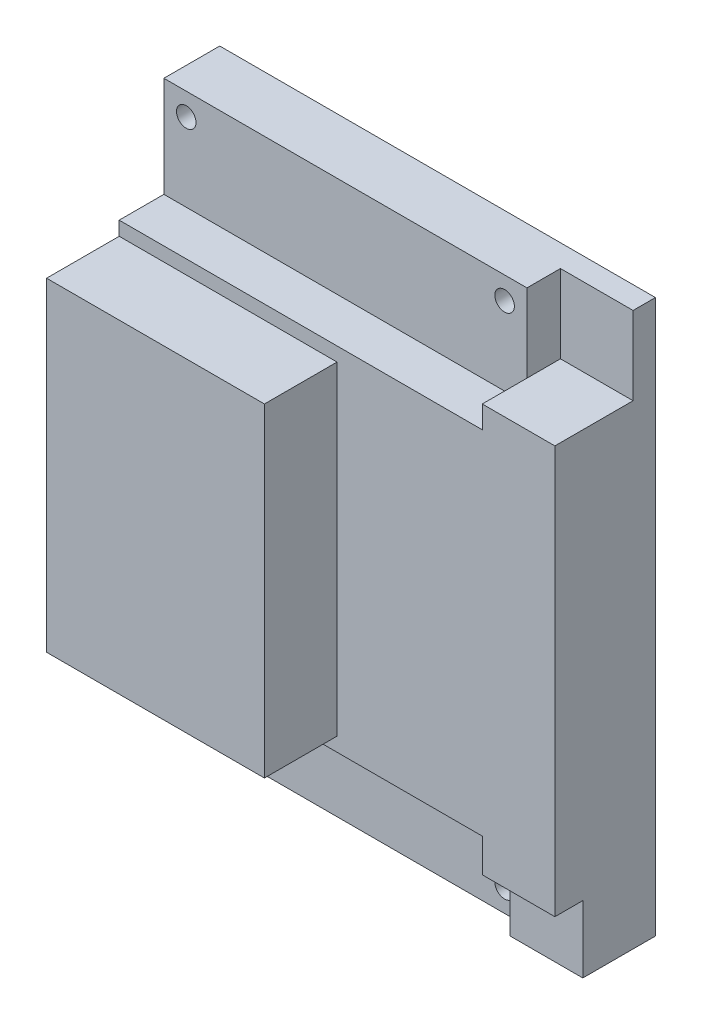
ISO-10303-21;
HEADER;
FILE_DESCRIPTION(('STEP AP214'),'2;1');
FILE_NAME('part.step','',(''),(''),'','','');
FILE_SCHEMA(('AUTOMOTIVE_DESIGN { 1 0 10303 214 1 1 1 1 }'));
ENDSEC;
DATA;
#1=APPLICATION_CONTEXT('core data for automotive mechanical design processes');
#2=APPLICATION_PROTOCOL_DEFINITION('international standard','automotive_design',2000,#1);
#3=PRODUCT_CONTEXT('',#1,'mechanical');
#4=PRODUCT('Part','Part','',(#3));
#5=PRODUCT_RELATED_PRODUCT_CATEGORY('part','',(#4));
#6=PRODUCT_DEFINITION_FORMATION('','',#4);
#7=PRODUCT_DEFINITION_CONTEXT('part definition',#1,'design');
#8=PRODUCT_DEFINITION('design','',#6,#7);
#9=PRODUCT_DEFINITION_SHAPE('','',#8);
#10=(LENGTH_UNIT() NAMED_UNIT(*) SI_UNIT(.MILLI.,.METRE.));
#11=(NAMED_UNIT(*) PLANE_ANGLE_UNIT() SI_UNIT($,.RADIAN.));
#12=(NAMED_UNIT(*) SI_UNIT($,.STERADIAN.) SOLID_ANGLE_UNIT());
#13=UNCERTAINTY_MEASURE_WITH_UNIT(LENGTH_MEASURE(1.E-05),#10,'distance_accuracy_value','');
#14=(GEOMETRIC_REPRESENTATION_CONTEXT(3) GLOBAL_UNCERTAINTY_ASSIGNED_CONTEXT((#13)) GLOBAL_UNIT_ASSIGNED_CONTEXT((#10,
#11,#12)) REPRESENTATION_CONTEXT('',''));
#15=CARTESIAN_POINT('',(0.,0.,0.));
#16=DIRECTION('',(0.,0.,1.));
#17=DIRECTION('',(1.,0.,0.));
#18=AXIS2_PLACEMENT_3D('',#15,#16,#17);
#19=CARTESIAN_POINT('',(32.5,42.5,4.));
#20=DIRECTION('',(0.,0.,1.));
#21=DIRECTION('',(1.,0.,0.));
#22=AXIS2_PLACEMENT_3D('',#19,#20,#21);
#23=PLANE('',#22);
#24=DIRECTION('',(0.,-1.,0.));
#25=VECTOR('',#24,1.);
#26=CARTESIAN_POINT('',(26.,49.5,4.));
#27=LINE('',#26,#25);
#28=CARTESIAN_POINT('',(26.,49.5,4.));
#29=VERTEX_POINT('',#28);
#30=CARTESIAN_POINT('',(26.,35.5,4.));
#31=VERTEX_POINT('',#30);
#32=EDGE_CURVE('E10',#29,#31,#27,.T.);
#33=ORIENTED_EDGE('',*,*,#32,.T.);
#34=DIRECTION('',(1.,0.,0.));
#35=VECTOR('',#34,1.);
#36=CARTESIAN_POINT('',(26.,35.5,4.));
#37=LINE('',#36,#35);
#38=CARTESIAN_POINT('',(39.,35.5,4.));
#39=VERTEX_POINT('',#38);
#40=EDGE_CURVE('E387',#31,#39,#37,.T.);
#41=ORIENTED_EDGE('',*,*,#40,.T.);
#42=DIRECTION('',(0.,1.,0.));
#43=VECTOR('',#42,1.);
#44=CARTESIAN_POINT('',(39.,35.5,4.));
#45=LINE('',#44,#43);
#46=CARTESIAN_POINT('',(39.,49.5,4.));
#47=VERTEX_POINT('',#46);
#48=EDGE_CURVE('E364',#39,#47,#45,.T.);
#49=ORIENTED_EDGE('',*,*,#48,.T.);
#50=DIRECTION('',(-1.,0.,0.));
#51=VECTOR('',#50,1.);
#52=CARTESIAN_POINT('',(39.,49.5,4.));
#53=LINE('',#52,#51);
#54=EDGE_CURVE('E422',#47,#29,#53,.T.);
#55=ORIENTED_EDGE('',*,*,#54,.T.);
#56=EDGE_LOOP('',(#33,#41,#49,#55));
#57=FACE_BOUND('',#56,.T.);
#58=ADVANCED_FACE('F15',(#57),#23,.T.);
#59=CARTESIAN_POINT('',(26.,49.5,18.));
#60=DIRECTION('',(-1.,0.,0.));
#61=DIRECTION('',(0.,0.,1.));
#62=AXIS2_PLACEMENT_3D('',#59,#60,#61);
#63=PLANE('',#62);
#64=DIRECTION('',(0.,0.,-1.));
#65=VECTOR('',#64,1.);
#66=CARTESIAN_POINT('',(26.,35.5,18.));
#67=LINE('',#66,#65);
#68=CARTESIAN_POINT('',(26.,35.5,10.));
#69=VERTEX_POINT('',#68);
#70=EDGE_CURVE('E18',#69,#31,#67,.T.);
#71=ORIENTED_EDGE('',*,*,#70,.T.);
#72=ORIENTED_EDGE('',*,*,#32,.F.);
#73=DIRECTION('',(0.,0.,-1.));
#74=VECTOR('',#73,1.);
#75=CARTESIAN_POINT('',(26.,49.5,18.));
#76=LINE('',#75,#74);
#77=CARTESIAN_POINT('',(26.,49.5,10.));
#78=VERTEX_POINT('',#77);
#79=EDGE_CURVE('E414',#78,#29,#76,.T.);
#80=ORIENTED_EDGE('',*,*,#79,.F.);
#81=DIRECTION('',(0.,1.,0.));
#82=VECTOR('',#81,1.);
#83=CARTESIAN_POINT('',(26.,31.5,10.));
#84=LINE('',#83,#82);
#85=EDGE_CURVE('E227',#69,#78,#84,.T.);
#86=ORIENTED_EDGE('',*,*,#85,.F.);
#87=EDGE_LOOP('',(#71,#72,#80,#86));
#88=FACE_BOUND('',#87,.T.);
#89=ADVANCED_FACE('F451',(#88),#63,.F.);
#90=CARTESIAN_POINT('',(0.,-29.,31.));
#91=DIRECTION('',(1.,0.,0.));
#92=DIRECTION('',(0.,1.,0.));
#93=AXIS2_PLACEMENT_3D('',#90,#91,#92);
#94=PLANE('',#93);
#95=DIRECTION('',(0.,0.,-1.));
#96=VECTOR('',#95,1.);
#97=CARTESIAN_POINT('',(0.,-29.,31.));
#98=LINE('',#97,#96);
#99=CARTESIAN_POINT('',(0.,-29.,31.));
#100=VERTEX_POINT('',#99);
#101=CARTESIAN_POINT('',(0.,-29.,18.));
#102=VERTEX_POINT('',#101);
#103=EDGE_CURVE('E382',#100,#102,#98,.T.);
#104=ORIENTED_EDGE('',*,*,#103,.T.);
#105=DIRECTION('',(0.,1.,0.));
#106=VECTOR('',#105,1.);
#107=CARTESIAN_POINT('',(0.,-29.,18.));
#108=LINE('',#107,#106);
#109=CARTESIAN_POINT('',(0.,29.,18.));
#110=VERTEX_POINT('',#109);
#111=EDGE_CURVE('E265',#102,#110,#108,.T.);
#112=ORIENTED_EDGE('',*,*,#111,.T.);
#113=DIRECTION('',(0.,0.,-1.));
#114=VECTOR('',#113,1.);
#115=CARTESIAN_POINT('',(0.,29.,31.));
#116=LINE('',#115,#114);
#117=CARTESIAN_POINT('',(0.,29.,31.));
#118=VERTEX_POINT('',#117);
#119=EDGE_CURVE('E399',#118,#110,#116,.T.);
#120=ORIENTED_EDGE('',*,*,#119,.F.);
#121=DIRECTION('',(0.,1.,0.));
#122=VECTOR('',#121,1.);
#123=CARTESIAN_POINT('',(0.,-29.,31.));
#124=LINE('',#123,#122);
#125=EDGE_CURVE('E395',#100,#118,#124,.T.);
#126=ORIENTED_EDGE('',*,*,#125,.F.);
#127=EDGE_LOOP('',(#104,#112,#120,#126));
#128=FACE_BOUND('',#127,.T.);
#129=ADVANCED_FACE('F551',(#128),#94,.T.);
#130=CARTESIAN_POINT('',(39.,-37.5,18.));
#131=DIRECTION('',(0.,1.,0.));
#132=DIRECTION('',(1.,0.,0.));
#133=AXIS2_PLACEMENT_3D('',#130,#131,#132);
#134=PLANE('',#133);
#135=DIRECTION('',(-1.,0.,0.));
#136=VECTOR('',#135,1.);
#137=CARTESIAN_POINT('',(39.,-37.5,18.));
#138=LINE('',#137,#136);
#139=CARTESIAN_POINT('',(39.,-37.5,18.));
#140=VERTEX_POINT('',#139);
#141=CARTESIAN_POINT('',(26.,-37.5,18.));
#142=VERTEX_POINT('',#141);
#143=EDGE_CURVE('E372',#140,#142,#138,.T.);
#144=ORIENTED_EDGE('',*,*,#143,.T.);
#145=DIRECTION('',(0.,0.,-1.));
#146=VECTOR('',#145,1.);
#147=CARTESIAN_POINT('',(26.,-37.5,18.));
#148=LINE('',#147,#146);
#149=CARTESIAN_POINT('',(26.,-37.5,13.));
#150=VERTEX_POINT('',#149);
#151=EDGE_CURVE('E44',#142,#150,#148,.T.);
#152=ORIENTED_EDGE('',*,*,#151,.T.);
#153=DIRECTION('',(-1.,0.,0.));
#154=VECTOR('',#153,1.);
#155=CARTESIAN_POINT('',(39.,-37.5,13.));
#156=LINE('',#155,#154);
#157=CARTESIAN_POINT('',(39.,-37.5,13.));
#158=VERTEX_POINT('',#157);
#159=EDGE_CURVE('E337',#158,#150,#156,.T.);
#160=ORIENTED_EDGE('',*,*,#159,.F.);
#161=DIRECTION('',(0.,0.,-1.));
#162=VECTOR('',#161,1.);
#163=CARTESIAN_POINT('',(39.,-37.5,18.));
#164=LINE('',#163,#162);
#165=EDGE_CURVE('E431',#140,#158,#164,.T.);
#166=ORIENTED_EDGE('',*,*,#165,.F.);
#167=EDGE_LOOP('',(#144,#152,#160,#166));
#168=FACE_BOUND('',#167,.T.);
#169=ADVANCED_FACE('F501',(#168),#134,.F.);
#170=CARTESIAN_POINT('',(26.,35.5,18.));
#171=DIRECTION('',(0.,-1.,0.));
#172=DIRECTION('',(0.,0.,-1.));
#173=AXIS2_PLACEMENT_3D('',#170,#171,#172);
#174=PLANE('',#173);
#175=DIRECTION('',(1.,0.,0.));
#176=VECTOR('',#175,1.);
#177=CARTESIAN_POINT('',(26.,35.5,18.));
#178=LINE('',#177,#176);
#179=CARTESIAN_POINT('',(26.,35.5,18.));
#180=VERTEX_POINT('',#179);
#181=CARTESIAN_POINT('',(39.,35.5,18.));
#182=VERTEX_POINT('',#181);
#183=EDGE_CURVE('E286',#180,#182,#178,.T.);
#184=ORIENTED_EDGE('',*,*,#183,.T.);
#185=DIRECTION('',(0.,0.,-1.));
#186=VECTOR('',#185,1.);
#187=CARTESIAN_POINT('',(39.,35.5,18.));
#188=LINE('',#187,#186);
#189=EDGE_CURVE('E367',#182,#39,#188,.T.);
#190=ORIENTED_EDGE('',*,*,#189,.T.);
#191=ORIENTED_EDGE('',*,*,#40,.F.);
#192=ORIENTED_EDGE('',*,*,#70,.F.);
#193=DIRECTION('',(0.,0.,-1.));
#194=VECTOR('',#193,1.);
#195=CARTESIAN_POINT('',(26.,35.5,18.));
#196=LINE('',#195,#194);
#197=EDGE_CURVE('E383',#180,#69,#196,.T.);
#198=ORIENTED_EDGE('',*,*,#197,.F.);
#199=EDGE_LOOP('',(#184,#190,#191,#192,#198));
#200=FACE_BOUND('',#199,.T.);
#201=ADVANCED_FACE('F453',(#200),#174,.F.);
#202=CARTESIAN_POINT('',(26.,31.5,18.));
#203=DIRECTION('',(1.,0.,0.));
#204=DIRECTION('',(0.,1.,0.));
#205=AXIS2_PLACEMENT_3D('',#202,#203,#204);
#206=PLANE('',#205);
#207=ORIENTED_EDGE('',*,*,#197,.T.);
#208=DIRECTION('',(0.,1.,0.));
#209=VECTOR('',#208,1.);
#210=CARTESIAN_POINT('',(26.,31.5,10.));
#211=LINE('',#210,#209);
#212=CARTESIAN_POINT('',(26.,31.5,10.));
#213=VERTEX_POINT('',#212);
#214=EDGE_CURVE('E271',#213,#69,#211,.T.);
#215=ORIENTED_EDGE('',*,*,#214,.F.);
#216=DIRECTION('',(0.,0.,-1.));
#217=VECTOR('',#216,1.);
#218=CARTESIAN_POINT('',(26.,31.5,18.));
#219=LINE('',#218,#217);
#220=CARTESIAN_POINT('',(26.,31.5,18.));
#221=VERTEX_POINT('',#220);
#222=EDGE_CURVE('E402',#221,#213,#219,.T.);
#223=ORIENTED_EDGE('',*,*,#222,.F.);
#224=DIRECTION('',(0.,1.,0.));
#225=VECTOR('',#224,1.);
#226=CARTESIAN_POINT('',(26.,31.5,18.));
#227=LINE('',#226,#225);
#228=EDGE_CURVE('E290',#221,#180,#227,.T.);
#229=ORIENTED_EDGE('',*,*,#228,.T.);
#230=EDGE_LOOP('',(#207,#215,#223,#229));
#231=FACE_BOUND('',#230,.T.);
#232=ADVANCED_FACE('F496',(#231),#206,.F.);
#233=CARTESIAN_POINT('',(26.,-31.5,18.));
#234=DIRECTION('',(-1.,0.,0.));
#235=DIRECTION('',(0.,0.,1.));
#236=AXIS2_PLACEMENT_3D('',#233,#234,#235);
#237=PLANE('',#236);
#238=DIRECTION('',(0.,-1.,0.));
#239=VECTOR('',#238,1.);
#240=CARTESIAN_POINT('',(26.,-31.5,18.));
#241=LINE('',#240,#239);
#242=CARTESIAN_POINT('',(26.,-31.5,18.));
#243=VERTEX_POINT('',#242);
#244=EDGE_CURVE('E264',#243,#142,#241,.T.);
#245=ORIENTED_EDGE('',*,*,#244,.F.);
#246=DIRECTION('',(0.,0.,-1.));
#247=VECTOR('',#246,1.);
#248=CARTESIAN_POINT('',(26.,-31.5,18.));
#249=LINE('',#248,#247);
#250=CARTESIAN_POINT('',(26.,-31.5,10.));
#251=VERTEX_POINT('',#250);
#252=EDGE_CURVE('E351',#243,#251,#249,.T.);
#253=ORIENTED_EDGE('',*,*,#252,.T.);
#254=DIRECTION('',(0.,-1.,0.));
#255=VECTOR('',#254,1.);
#256=CARTESIAN_POINT('',(26.,-31.5,10.));
#257=LINE('',#256,#255);
#258=CARTESIAN_POINT('',(26.,-49.5,10.));
#259=VERTEX_POINT('',#258);
#260=EDGE_CURVE('E330',#251,#259,#257,.T.);
#261=ORIENTED_EDGE('',*,*,#260,.T.);
#262=DIRECTION('',(0.,0.,-1.));
#263=VECTOR('',#262,1.);
#264=CARTESIAN_POINT('',(26.,-49.5,18.));
#265=LINE('',#264,#263);
#266=CARTESIAN_POINT('',(26.,-49.5,13.));
#267=VERTEX_POINT('',#266);
#268=EDGE_CURVE('E323',#267,#259,#265,.T.);
#269=ORIENTED_EDGE('',*,*,#268,.F.);
#270=DIRECTION('',(0.,-1.,0.));
#271=VECTOR('',#270,1.);
#272=CARTESIAN_POINT('',(26.,-37.5,13.));
#273=LINE('',#272,#271);
#274=EDGE_CURVE('E334',#150,#267,#273,.T.);
#275=ORIENTED_EDGE('',*,*,#274,.F.);
#276=ORIENTED_EDGE('',*,*,#151,.F.);
#277=EDGE_LOOP('',(#245,#253,#261,#269,#275,#276));
#278=FACE_BOUND('',#277,.T.);
#279=ADVANCED_FACE('F508',(#278),#237,.T.);
#280=CARTESIAN_POINT('',(32.5,-43.5,13.));
#281=DIRECTION('',(0.,0.,1.));
#282=DIRECTION('',(1.,0.,0.));
#283=AXIS2_PLACEMENT_3D('',#280,#281,#282);
#284=PLANE('',#283);
#285=ORIENTED_EDGE('',*,*,#274,.T.);
#286=DIRECTION('',(1.,0.,0.));
#287=VECTOR('',#286,1.);
#288=CARTESIAN_POINT('',(26.,-49.5,13.));
#289=LINE('',#288,#287);
#290=CARTESIAN_POINT('',(39.,-49.5,13.));
#291=VERTEX_POINT('',#290);
#292=EDGE_CURVE('E319',#267,#291,#289,.T.);
#293=ORIENTED_EDGE('',*,*,#292,.T.);
#294=DIRECTION('',(0.,1.,0.));
#295=VECTOR('',#294,1.);
#296=CARTESIAN_POINT('',(39.,-49.5,13.));
#297=LINE('',#296,#295);
#298=EDGE_CURVE('E435',#291,#158,#297,.T.);
#299=ORIENTED_EDGE('',*,*,#298,.T.);
#300=ORIENTED_EDGE('',*,*,#159,.T.);
#301=EDGE_LOOP('',(#285,#293,#299,#300));
#302=FACE_BOUND('',#301,.T.);
#303=ADVANCED_FACE('F504',(#302),#284,.T.);
#304=CARTESIAN_POINT('',(22.,45.5,17.));
#305=DIRECTION('',(0.,0.,1.));
#306=DIRECTION('',(1.,0.,0.));
#307=AXIS2_PLACEMENT_3D('',#304,#305,#306);
#308=CYLINDRICAL_SURFACE('',#307,1.75);
#309=DIRECTION('',(0.,0.,-1.));
#310=VECTOR('',#309,1.);
#311=CARTESIAN_POINT('',(23.75,45.5,17.));
#312=LINE('',#311,#310);
#313=CARTESIAN_POINT('',(23.75,45.5,10.));
#314=VERTEX_POINT('',#313);
#315=CARTESIAN_POINT('',(23.75,45.5,0.));
#316=VERTEX_POINT('',#315);
#317=EDGE_CURVE('E338',#314,#316,#312,.T.);
#318=ORIENTED_EDGE('',*,*,#317,.T.);
#319=CARTESIAN_POINT('',(22.,45.5,0.));
#320=DIRECTION('',(0.,0.,1.));
#321=DIRECTION('',(1.,0.,0.));
#322=AXIS2_PLACEMENT_3D('',#319,#320,#321);
#323=CIRCLE('',#322,1.75);
#324=EDGE_CURVE('E311',#316,#316,#323,.T.);
#325=ORIENTED_EDGE('',*,*,#324,.F.);
#326=ORIENTED_EDGE('',*,*,#317,.F.);
#327=CARTESIAN_POINT('',(22.,45.5,10.));
#328=DIRECTION('',(0.,0.,1.));
#329=DIRECTION('',(1.,0.,0.));
#330=AXIS2_PLACEMENT_3D('',#327,#328,#329);
#331=CIRCLE('',#330,1.75);
#332=EDGE_CURVE('E410',#314,#314,#331,.T.);
#333=ORIENTED_EDGE('',*,*,#332,.T.);
#334=EDGE_LOOP('',(#318,#325,#326,#333));
#335=FACE_BOUND('',#334,.T.);
#336=ADVANCED_FACE('F566',(#335),#308,.F.);
#337=CARTESIAN_POINT('',(-35.,45.5,17.));
#338=DIRECTION('',(0.,0.,1.));
#339=DIRECTION('',(1.,0.,0.));
#340=AXIS2_PLACEMENT_3D('',#337,#338,#339);
#341=CYLINDRICAL_SURFACE('',#340,1.75);
#342=DIRECTION('',(0.,0.,-1.));
#343=VECTOR('',#342,1.);
#344=CARTESIAN_POINT('',(-33.25,45.5,17.));
#345=LINE('',#344,#343);
#346=CARTESIAN_POINT('',(-33.25,45.5,10.));
#347=VERTEX_POINT('',#346);
#348=CARTESIAN_POINT('',(-33.25,45.5,0.));
#349=VERTEX_POINT('',#348);
#350=EDGE_CURVE('E343',#347,#349,#345,.T.);
#351=ORIENTED_EDGE('',*,*,#350,.T.);
#352=CARTESIAN_POINT('',(-35.,45.5,0.));
#353=DIRECTION('',(0.,0.,1.));
#354=DIRECTION('',(1.,0.,0.));
#355=AXIS2_PLACEMENT_3D('',#352,#353,#354);
#356=CIRCLE('',#355,1.75);
#357=EDGE_CURVE('E302',#349,#349,#356,.T.);
#358=ORIENTED_EDGE('',*,*,#357,.F.);
#359=ORIENTED_EDGE('',*,*,#350,.F.);
#360=CARTESIAN_POINT('',(-35.,45.5,10.));
#361=DIRECTION('',(0.,0.,1.));
#362=DIRECTION('',(1.,0.,0.));
#363=AXIS2_PLACEMENT_3D('',#360,#361,#362);
#364=CIRCLE('',#363,1.75);
#365=EDGE_CURVE('E231',#347,#347,#364,.T.);
#366=ORIENTED_EDGE('',*,*,#365,.T.);
#367=EDGE_LOOP('',(#351,#358,#359,#366));
#368=FACE_BOUND('',#367,.T.);
#369=ADVANCED_FACE('F569',(#368),#341,.F.);
#370=CARTESIAN_POINT('',(22.,-45.5,17.));
#371=DIRECTION('',(0.,0.,1.));
#372=DIRECTION('',(1.,0.,0.));
#373=AXIS2_PLACEMENT_3D('',#370,#371,#372);
#374=CYLINDRICAL_SURFACE('',#373,1.75);
#375=DIRECTION('',(0.,0.,-1.));
#376=VECTOR('',#375,1.);
#377=CARTESIAN_POINT('',(23.75,-45.5,17.));
#378=LINE('',#377,#376);
#379=CARTESIAN_POINT('',(23.75,-45.5,10.));
#380=VERTEX_POINT('',#379);
#381=CARTESIAN_POINT('',(23.75,-45.5,0.));
#382=VERTEX_POINT('',#381);
#383=EDGE_CURVE('E346',#380,#382,#378,.T.);
#384=ORIENTED_EDGE('',*,*,#383,.T.);
#385=CARTESIAN_POINT('',(22.,-45.5,0.));
#386=DIRECTION('',(0.,0.,1.));
#387=DIRECTION('',(1.,0.,0.));
#388=AXIS2_PLACEMENT_3D('',#385,#386,#387);
#389=CIRCLE('',#388,1.75);
#390=EDGE_CURVE('E299',#382,#382,#389,.T.);
#391=ORIENTED_EDGE('',*,*,#390,.F.);
#392=ORIENTED_EDGE('',*,*,#383,.F.);
#393=CARTESIAN_POINT('',(22.,-45.5,10.));
#394=DIRECTION('',(0.,0.,1.));
#395=DIRECTION('',(1.,0.,0.));
#396=AXIS2_PLACEMENT_3D('',#393,#394,#395);
#397=CIRCLE('',#396,1.75);
#398=EDGE_CURVE('E350',#380,#380,#397,.T.);
#399=ORIENTED_EDGE('',*,*,#398,.T.);
#400=EDGE_LOOP('',(#384,#391,#392,#399));
#401=FACE_BOUND('',#400,.T.);
#402=ADVANCED_FACE('F575',(#401),#374,.F.);
#403=CARTESIAN_POINT('',(-35.,-45.5,17.));
#404=DIRECTION('',(0.,0.,1.));
#405=DIRECTION('',(1.,0.,0.));
#406=AXIS2_PLACEMENT_3D('',#403,#404,#405);
#407=CYLINDRICAL_SURFACE('',#406,1.75);
#408=DIRECTION('',(0.,0.,-1.));
#409=VECTOR('',#408,1.);
#410=CARTESIAN_POINT('',(-33.25,-45.5,17.));
#411=LINE('',#410,#409);
#412=CARTESIAN_POINT('',(-33.25,-45.5,10.));
#413=VERTEX_POINT('',#412);
#414=CARTESIAN_POINT('',(-33.25,-45.5,0.));
#415=VERTEX_POINT('',#414);
#416=EDGE_CURVE('E436',#413,#415,#411,.T.);
#417=ORIENTED_EDGE('',*,*,#416,.T.);
#418=CARTESIAN_POINT('',(-35.,-45.5,0.));
#419=DIRECTION('',(0.,0.,1.));
#420=DIRECTION('',(1.,0.,0.));
#421=AXIS2_PLACEMENT_3D('',#418,#419,#420);
#422=CIRCLE('',#421,1.75);
#423=EDGE_CURVE('E303',#415,#415,#422,.T.);
#424=ORIENTED_EDGE('',*,*,#423,.F.);
#425=ORIENTED_EDGE('',*,*,#416,.F.);
#426=CARTESIAN_POINT('',(-35.,-45.5,10.));
#427=DIRECTION('',(0.,0.,1.));
#428=DIRECTION('',(1.,0.,0.));
#429=AXIS2_PLACEMENT_3D('',#426,#427,#428);
#430=CIRCLE('',#429,1.75);
#431=EDGE_CURVE('E342',#413,#413,#430,.T.);
#432=ORIENTED_EDGE('',*,*,#431,.T.);
#433=EDGE_LOOP('',(#417,#424,#425,#432));
#434=FACE_BOUND('',#433,.T.);
#435=ADVANCED_FACE('F573',(#434),#407,.F.);
#436=CARTESIAN_POINT('',(39.,-49.5,0.));
#437=DIRECTION('',(-1.,0.,0.));
#438=DIRECTION('',(0.,0.,1.));
#439=AXIS2_PLACEMENT_3D('',#436,#437,#438);
#440=PLANE('',#439);
#441=DIRECTION('',(0.,0.,1.));
#442=VECTOR('',#441,1.);
#443=CARTESIAN_POINT('',(39.,49.5,0.));
#444=LINE('',#443,#442);
#445=CARTESIAN_POINT('',(39.,49.5,0.));
#446=VERTEX_POINT('',#445);
#447=EDGE_CURVE('E368',#446,#47,#444,.T.);
#448=ORIENTED_EDGE('',*,*,#447,.T.);
#449=ORIENTED_EDGE('',*,*,#48,.F.);
#450=ORIENTED_EDGE('',*,*,#189,.F.);
#451=DIRECTION('',(0.,-1.,0.));
#452=VECTOR('',#451,1.);
#453=CARTESIAN_POINT('',(39.,49.5,18.));
#454=LINE('',#453,#452);
#455=EDGE_CURVE('E291',#182,#140,#454,.T.);
#456=ORIENTED_EDGE('',*,*,#455,.T.);
#457=ORIENTED_EDGE('',*,*,#165,.T.);
#458=ORIENTED_EDGE('',*,*,#298,.F.);
#459=DIRECTION('',(0.,0.,1.));
#460=VECTOR('',#459,1.);
#461=CARTESIAN_POINT('',(39.,-49.5,0.));
#462=LINE('',#461,#460);
#463=CARTESIAN_POINT('',(39.,-49.5,0.));
#464=VERTEX_POINT('',#463);
#465=EDGE_CURVE('E315',#464,#291,#462,.T.);
#466=ORIENTED_EDGE('',*,*,#465,.F.);
#467=DIRECTION('',(0.,1.,0.));
#468=VECTOR('',#467,1.);
#469=CARTESIAN_POINT('',(39.,-49.5,0.));
#470=LINE('',#469,#468);
#471=EDGE_CURVE('E277',#464,#446,#470,.T.);
#472=ORIENTED_EDGE('',*,*,#471,.T.);
#473=EDGE_LOOP('',(#448,#449,#450,#456,#457,#458,#466,#472));
#474=FACE_BOUND('',#473,.T.);
#475=ADVANCED_FACE('F458',(#474),#440,.F.);
#476=CARTESIAN_POINT('',(39.,49.5,0.));
#477=DIRECTION('',(0.,-1.,0.));
#478=DIRECTION('',(0.,0.,-1.));
#479=AXIS2_PLACEMENT_3D('',#476,#477,#478);
#480=PLANE('',#479);
#481=DIRECTION('',(0.,0.,1.));
#482=VECTOR('',#481,1.);
#483=CARTESIAN_POINT('',(-39.,49.5,0.));
#484=LINE('',#483,#482);
#485=CARTESIAN_POINT('',(-39.,49.5,0.));
#486=VERTEX_POINT('',#485);
#487=CARTESIAN_POINT('',(-39.,49.5,10.));
#488=VERTEX_POINT('',#487);
#489=EDGE_CURVE('E234',#486,#488,#484,.T.);
#490=ORIENTED_EDGE('',*,*,#489,.T.);
#491=DIRECTION('',(-1.,0.,0.));
#492=VECTOR('',#491,1.);
#493=CARTESIAN_POINT('',(26.,49.5,10.));
#494=LINE('',#493,#492);
#495=EDGE_CURVE('E218',#78,#488,#494,.T.);
#496=ORIENTED_EDGE('',*,*,#495,.F.);
#497=ORIENTED_EDGE('',*,*,#79,.T.);
#498=ORIENTED_EDGE('',*,*,#54,.F.);
#499=ORIENTED_EDGE('',*,*,#447,.F.);
#500=DIRECTION('',(-1.,0.,0.));
#501=VECTOR('',#500,1.);
#502=CARTESIAN_POINT('',(39.,49.5,0.));
#503=LINE('',#502,#501);
#504=EDGE_CURVE('E237',#446,#486,#503,.T.);
#505=ORIENTED_EDGE('',*,*,#504,.T.);
#506=EDGE_LOOP('',(#490,#496,#497,#498,#499,#505));
#507=FACE_BOUND('',#506,.T.);
#508=ADVANCED_FACE('F235',(#507),#480,.F.);
#509=CARTESIAN_POINT('',(-6.5,0.,10.));
#510=DIRECTION('',(0.,0.,1.));
#511=DIRECTION('',(1.,0.,0.));
#512=AXIS2_PLACEMENT_3D('',#509,#510,#511);
#513=PLANE('',#512);
#514=ORIENTED_EDGE('',*,*,#332,.F.);
#515=EDGE_LOOP('',(#514));
#516=FACE_BOUND('',#515,.T.);
#517=ORIENTED_EDGE('',*,*,#365,.F.);
#518=EDGE_LOOP('',(#517));
#519=FACE_BOUND('',#518,.T.);
#520=DIRECTION('',(0.,-1.,0.));
#521=VECTOR('',#520,1.);
#522=CARTESIAN_POINT('',(-39.,49.5,10.));
#523=LINE('',#522,#521);
#524=CARTESIAN_POINT('',(-39.,31.5,10.));
#525=VERTEX_POINT('',#524);
#526=EDGE_CURVE('E223',#488,#525,#523,.T.);
#527=ORIENTED_EDGE('',*,*,#526,.T.);
#528=DIRECTION('',(1.,0.,0.));
#529=VECTOR('',#528,1.);
#530=CARTESIAN_POINT('',(-39.,31.5,10.));
#531=LINE('',#530,#529);
#532=EDGE_CURVE('E274',#525,#213,#531,.T.);
#533=ORIENTED_EDGE('',*,*,#532,.T.);
#534=ORIENTED_EDGE('',*,*,#214,.T.);
#535=ORIENTED_EDGE('',*,*,#85,.T.);
#536=ORIENTED_EDGE('',*,*,#495,.T.);
#537=EDGE_LOOP('',(#527,#533,#534,#535,#536));
#538=FACE_BOUND('',#537,.T.);
#539=ADVANCED_FACE('F220',(#516,#519,#538),#513,.T.);
#540=CARTESIAN_POINT('',(-39.,31.5,18.));
#541=DIRECTION('',(0.,-1.,0.));
#542=DIRECTION('',(0.,0.,-1.));
#543=AXIS2_PLACEMENT_3D('',#540,#541,#542);
#544=PLANE('',#543);
#545=DIRECTION('',(1.,0.,0.));
#546=VECTOR('',#545,1.);
#547=CARTESIAN_POINT('',(-39.,31.5,18.));
#548=LINE('',#547,#546);
#549=CARTESIAN_POINT('',(-39.,31.5,18.));
#550=VERTEX_POINT('',#549);
#551=EDGE_CURVE('E378',#550,#221,#548,.T.);
#552=ORIENTED_EDGE('',*,*,#551,.T.);
#553=ORIENTED_EDGE('',*,*,#222,.T.);
#554=ORIENTED_EDGE('',*,*,#532,.F.);
#555=DIRECTION('',(0.,0.,-1.));
#556=VECTOR('',#555,1.);
#557=CARTESIAN_POINT('',(-39.,31.5,18.));
#558=LINE('',#557,#556);
#559=EDGE_CURVE('E248',#550,#525,#558,.T.);
#560=ORIENTED_EDGE('',*,*,#559,.F.);
#561=EDGE_LOOP('',(#552,#553,#554,#560));
#562=FACE_BOUND('',#561,.T.);
#563=ADVANCED_FACE('F535',(#562),#544,.F.);
#564=CARTESIAN_POINT('',(0.,29.,31.));
#565=DIRECTION('',(0.,1.,0.));
#566=DIRECTION('',(1.,0.,0.));
#567=AXIS2_PLACEMENT_3D('',#564,#565,#566);
#568=PLANE('',#567);
#569=ORIENTED_EDGE('',*,*,#119,.T.);
#570=DIRECTION('',(-1.,0.,0.));
#571=VECTOR('',#570,1.);
#572=CARTESIAN_POINT('',(0.,29.,18.));
#573=LINE('',#572,#571);
#574=CARTESIAN_POINT('',(-39.,29.,18.));
#575=VERTEX_POINT('',#574);
#576=EDGE_CURVE('E358',#110,#575,#573,.T.);
#577=ORIENTED_EDGE('',*,*,#576,.T.);
#578=DIRECTION('',(0.,0.,-1.));
#579=VECTOR('',#578,1.);
#580=CARTESIAN_POINT('',(-39.,29.,31.));
#581=LINE('',#580,#579);
#582=CARTESIAN_POINT('',(-39.,29.,31.));
#583=VERTEX_POINT('',#582);
#584=EDGE_CURVE('E285',#583,#575,#581,.T.);
#585=ORIENTED_EDGE('',*,*,#584,.F.);
#586=DIRECTION('',(-1.,0.,0.));
#587=VECTOR('',#586,1.);
#588=CARTESIAN_POINT('',(0.,29.,31.));
#589=LINE('',#588,#587);
#590=EDGE_CURVE('E392',#118,#583,#589,.T.);
#591=ORIENTED_EDGE('',*,*,#590,.F.);
#592=EDGE_LOOP('',(#569,#577,#585,#591));
#593=FACE_BOUND('',#592,.T.);
#594=ADVANCED_FACE('F533',(#593),#568,.T.);
#595=CARTESIAN_POINT('',(0.,0.,31.));
#596=DIRECTION('',(0.,0.,1.));
#597=DIRECTION('',(1.,0.,0.));
#598=AXIS2_PLACEMENT_3D('',#595,#596,#597);
#599=PLANE('',#598);
#600=ORIENTED_EDGE('',*,*,#590,.T.);
#601=DIRECTION('',(0.,-1.,0.));
#602=VECTOR('',#601,1.);
#603=CARTESIAN_POINT('',(-39.,49.5,31.));
#604=LINE('',#603,#602);
#605=CARTESIAN_POINT('',(-39.,-29.,31.));
#606=VERTEX_POINT('',#605);
#607=EDGE_CURVE('E270',#583,#606,#604,.T.);
#608=ORIENTED_EDGE('',*,*,#607,.T.);
#609=DIRECTION('',(1.,0.,0.));
#610=VECTOR('',#609,1.);
#611=CARTESIAN_POINT('',(-39.,-29.,31.));
#612=LINE('',#611,#610);
#613=EDGE_CURVE('E388',#606,#100,#612,.T.);
#614=ORIENTED_EDGE('',*,*,#613,.T.);
#615=ORIENTED_EDGE('',*,*,#125,.T.);
#616=EDGE_LOOP('',(#600,#608,#614,#615));
#617=FACE_BOUND('',#616,.T.);
#618=ADVANCED_FACE('F530',(#617),#599,.T.);
#619=CARTESIAN_POINT('',(-39.,-29.,31.));
#620=DIRECTION('',(0.,-1.,0.));
#621=DIRECTION('',(0.,0.,-1.));
#622=AXIS2_PLACEMENT_3D('',#619,#620,#621);
#623=PLANE('',#622);
#624=DIRECTION('',(0.,0.,-1.));
#625=VECTOR('',#624,1.);
#626=CARTESIAN_POINT('',(-39.,-29.,31.));
#627=LINE('',#626,#625);
#628=CARTESIAN_POINT('',(-39.,-29.,18.));
#629=VERTEX_POINT('',#628);
#630=EDGE_CURVE('E266',#606,#629,#627,.T.);
#631=ORIENTED_EDGE('',*,*,#630,.T.);
#632=DIRECTION('',(1.,0.,0.));
#633=VECTOR('',#632,1.);
#634=CARTESIAN_POINT('',(-39.,-29.,18.));
#635=LINE('',#634,#633);
#636=EDGE_CURVE('E261',#629,#102,#635,.T.);
#637=ORIENTED_EDGE('',*,*,#636,.T.);
#638=ORIENTED_EDGE('',*,*,#103,.F.);
#639=ORIENTED_EDGE('',*,*,#613,.F.);
#640=EDGE_LOOP('',(#631,#637,#638,#639));
#641=FACE_BOUND('',#640,.T.);
#642=ADVANCED_FACE('F526',(#641),#623,.T.);
#643=CARTESIAN_POINT('',(1.715277777778,0.,18.));
#644=DIRECTION('',(0.,0.,1.));
#645=DIRECTION('',(1.,0.,0.));
#646=AXIS2_PLACEMENT_3D('',#643,#644,#645);
#647=PLANE('',#646);
#648=DIRECTION('',(0.,1.,0.));
#649=VECTOR('',#648,1.);
#650=CARTESIAN_POINT('',(-39.,29.,18.));
#651=LINE('',#650,#649);
#652=EDGE_CURVE('E255',#575,#550,#651,.T.);
#653=ORIENTED_EDGE('',*,*,#652,.F.);
#654=ORIENTED_EDGE('',*,*,#576,.F.);
#655=ORIENTED_EDGE('',*,*,#111,.F.);
#656=ORIENTED_EDGE('',*,*,#636,.F.);
#657=DIRECTION('',(0.,1.,0.));
#658=VECTOR('',#657,1.);
#659=CARTESIAN_POINT('',(-39.,-49.5,18.));
#660=LINE('',#659,#658);
#661=CARTESIAN_POINT('',(-39.,-31.5,18.));
#662=VERTEX_POINT('',#661);
#663=EDGE_CURVE('E259',#662,#629,#660,.T.);
#664=ORIENTED_EDGE('',*,*,#663,.F.);
#665=DIRECTION('',(1.,0.,0.));
#666=VECTOR('',#665,1.);
#667=CARTESIAN_POINT('',(-39.,-31.5,18.));
#668=LINE('',#667,#666);
#669=EDGE_CURVE('E354',#662,#243,#668,.T.);
#670=ORIENTED_EDGE('',*,*,#669,.T.);
#671=ORIENTED_EDGE('',*,*,#244,.T.);
#672=ORIENTED_EDGE('',*,*,#143,.F.);
#673=ORIENTED_EDGE('',*,*,#455,.F.);
#674=ORIENTED_EDGE('',*,*,#183,.F.);
#675=ORIENTED_EDGE('',*,*,#228,.F.);
#676=ORIENTED_EDGE('',*,*,#551,.F.);
#677=EDGE_LOOP('',(#653,#654,#655,#656,#664,#670,#671,#672,#673,#674,#675,#676));
#678=FACE_BOUND('',#677,.T.);
#679=ADVANCED_FACE('F499',(#678),#647,.T.);
#680=CARTESIAN_POINT('',(-39.,-31.5,18.));
#681=DIRECTION('',(0.,-1.,0.));
#682=DIRECTION('',(0.,0.,-1.));
#683=AXIS2_PLACEMENT_3D('',#680,#681,#682);
#684=PLANE('',#683);
#685=DIRECTION('',(0.,0.,-1.));
#686=VECTOR('',#685,1.);
#687=CARTESIAN_POINT('',(-39.,-31.5,18.));
#688=LINE('',#687,#686);
#689=CARTESIAN_POINT('',(-39.,-31.5,10.));
#690=VERTEX_POINT('',#689);
#691=EDGE_CURVE('E477',#662,#690,#688,.T.);
#692=ORIENTED_EDGE('',*,*,#691,.T.);
#693=DIRECTION('',(1.,0.,0.));
#694=VECTOR('',#693,1.);
#695=CARTESIAN_POINT('',(-39.,-31.5,10.));
#696=LINE('',#695,#694);
#697=EDGE_CURVE('E333',#690,#251,#696,.T.);
#698=ORIENTED_EDGE('',*,*,#697,.T.);
#699=ORIENTED_EDGE('',*,*,#252,.F.);
#700=ORIENTED_EDGE('',*,*,#669,.F.);
#701=EDGE_LOOP('',(#692,#698,#699,#700));
#702=FACE_BOUND('',#701,.T.);
#703=ADVANCED_FACE('F518',(#702),#684,.T.);
#704=CARTESIAN_POINT('',(-6.5,0.,10.));
#705=DIRECTION('',(0.,0.,1.));
#706=DIRECTION('',(1.,0.,0.));
#707=AXIS2_PLACEMENT_3D('',#704,#705,#706);
#708=PLANE('',#707);
#709=ORIENTED_EDGE('',*,*,#398,.F.);
#710=EDGE_LOOP('',(#709));
#711=FACE_BOUND('',#710,.T.);
#712=ORIENTED_EDGE('',*,*,#431,.F.);
#713=EDGE_LOOP('',(#712));
#714=FACE_BOUND('',#713,.T.);
#715=DIRECTION('',(0.,1.,0.));
#716=VECTOR('',#715,1.);
#717=CARTESIAN_POINT('',(-39.,-49.5,10.));
#718=LINE('',#717,#716);
#719=CARTESIAN_POINT('',(-39.,-49.5,10.));
#720=VERTEX_POINT('',#719);
#721=EDGE_CURVE('E472',#720,#690,#718,.T.);
#722=ORIENTED_EDGE('',*,*,#721,.F.);
#723=DIRECTION('',(-1.,0.,0.));
#724=VECTOR('',#723,1.);
#725=CARTESIAN_POINT('',(26.,-49.5,10.));
#726=LINE('',#725,#724);
#727=EDGE_CURVE('E327',#259,#720,#726,.T.);
#728=ORIENTED_EDGE('',*,*,#727,.F.);
#729=ORIENTED_EDGE('',*,*,#260,.F.);
#730=ORIENTED_EDGE('',*,*,#697,.F.);
#731=EDGE_LOOP('',(#722,#728,#729,#730));
#732=FACE_BOUND('',#731,.T.);
#733=ADVANCED_FACE('F512',(#711,#714,#732),#708,.T.);
#734=CARTESIAN_POINT('',(-39.,-49.5,0.));
#735=DIRECTION('',(0.,1.,0.));
#736=DIRECTION('',(1.,0.,0.));
#737=AXIS2_PLACEMENT_3D('',#734,#735,#736);
#738=PLANE('',#737);
#739=ORIENTED_EDGE('',*,*,#465,.T.);
#740=ORIENTED_EDGE('',*,*,#292,.F.);
#741=ORIENTED_EDGE('',*,*,#268,.T.);
#742=ORIENTED_EDGE('',*,*,#727,.T.);
#743=DIRECTION('',(0.,0.,1.));
#744=VECTOR('',#743,1.);
#745=CARTESIAN_POINT('',(-39.,-49.5,0.));
#746=LINE('',#745,#744);
#747=CARTESIAN_POINT('',(-39.,-49.5,0.));
#748=VERTEX_POINT('',#747);
#749=EDGE_CURVE('E466',#748,#720,#746,.T.);
#750=ORIENTED_EDGE('',*,*,#749,.F.);
#751=DIRECTION('',(1.,0.,0.));
#752=VECTOR('',#751,1.);
#753=CARTESIAN_POINT('',(-39.,-49.5,0.));
#754=LINE('',#753,#752);
#755=EDGE_CURVE('E281',#748,#464,#754,.T.);
#756=ORIENTED_EDGE('',*,*,#755,.T.);
#757=EDGE_LOOP('',(#739,#740,#741,#742,#750,#756));
#758=FACE_BOUND('',#757,.T.);
#759=ADVANCED_FACE('F468',(#758),#738,.F.);
#760=CARTESIAN_POINT('',(0.,0.,0.));
#761=DIRECTION('',(0.,0.,1.));
#762=DIRECTION('',(1.,0.,0.));
#763=AXIS2_PLACEMENT_3D('',#760,#761,#762);
#764=PLANE('',#763);
#765=ORIENTED_EDGE('',*,*,#324,.T.);
#766=EDGE_LOOP('',(#765));
#767=FACE_BOUND('',#766,.T.);
#768=ORIENTED_EDGE('',*,*,#357,.T.);
#769=EDGE_LOOP('',(#768));
#770=FACE_BOUND('',#769,.T.);
#771=ORIENTED_EDGE('',*,*,#390,.T.);
#772=EDGE_LOOP('',(#771));
#773=FACE_BOUND('',#772,.T.);
#774=ORIENTED_EDGE('',*,*,#423,.T.);
#775=EDGE_LOOP('',(#774));
#776=FACE_BOUND('',#775,.T.);
#777=ORIENTED_EDGE('',*,*,#504,.F.);
#778=ORIENTED_EDGE('',*,*,#471,.F.);
#779=ORIENTED_EDGE('',*,*,#755,.F.);
#780=DIRECTION('',(0.,-1.,0.));
#781=VECTOR('',#780,1.);
#782=CARTESIAN_POINT('',(-39.,49.5,0.));
#783=LINE('',#782,#781);
#784=EDGE_CURVE('E242',#486,#748,#783,.T.);
#785=ORIENTED_EDGE('',*,*,#784,.F.);
#786=EDGE_LOOP('',(#777,#778,#779,#785));
#787=FACE_BOUND('',#786,.T.);
#788=ADVANCED_FACE('F463',(#767,#770,#773,#776,#787),#764,.F.);
#789=CARTESIAN_POINT('',(-39.,49.5,0.));
#790=DIRECTION('',(1.,0.,0.));
#791=DIRECTION('',(0.,1.,0.));
#792=AXIS2_PLACEMENT_3D('',#789,#790,#791);
#793=PLANE('',#792);
#794=ORIENTED_EDGE('',*,*,#749,.T.);
#795=ORIENTED_EDGE('',*,*,#721,.T.);
#796=ORIENTED_EDGE('',*,*,#691,.F.);
#797=ORIENTED_EDGE('',*,*,#663,.T.);
#798=ORIENTED_EDGE('',*,*,#630,.F.);
#799=ORIENTED_EDGE('',*,*,#607,.F.);
#800=ORIENTED_EDGE('',*,*,#584,.T.);
#801=ORIENTED_EDGE('',*,*,#652,.T.);
#802=ORIENTED_EDGE('',*,*,#559,.T.);
#803=ORIENTED_EDGE('',*,*,#526,.F.);
#804=ORIENTED_EDGE('',*,*,#489,.F.);
#805=ORIENTED_EDGE('',*,*,#784,.T.);
#806=EDGE_LOOP('',(#794,#795,#796,#797,#798,#799,#800,#801,#802,#803,#804,#805));
#807=FACE_BOUND('',#806,.T.);
#808=ADVANCED_FACE('F245',(#807),#793,.F.);
#809=CLOSED_SHELL('',(#58,#89,#129,#169,#201,#232,#279,#303,#336,#369,#402,#435,#475,#508,#539,
#563,#594,#618,#642,#679,#703,#733,#759,#788,#808));
#810=MANIFOLD_SOLID_BREP('B1',#809);
#811=ADVANCED_BREP_SHAPE_REPRESENTATION('',(#18,#810),#14);
#812=SHAPE_DEFINITION_REPRESENTATION(#9,#811);
ENDSEC;
END-ISO-10303-21;
